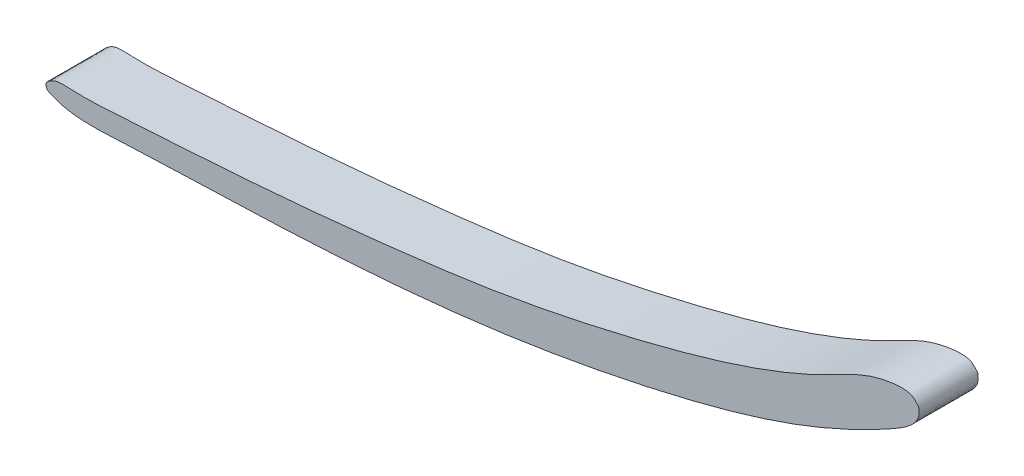
ISO-10303-21;
HEADER;
FILE_DESCRIPTION(('STEP AP214'),'2;1');
FILE_NAME('part.step','',(''),(''),'','','');
FILE_SCHEMA(('AUTOMOTIVE_DESIGN { 1 0 10303 214 1 1 1 1 }'));
ENDSEC;
DATA;
#1=APPLICATION_CONTEXT('core data for automotive mechanical design processes');
#2=APPLICATION_PROTOCOL_DEFINITION('international standard','automotive_design',2000,#1);
#3=PRODUCT_CONTEXT('',#1,'mechanical');
#4=PRODUCT('Part','Part','',(#3));
#5=PRODUCT_RELATED_PRODUCT_CATEGORY('part','',(#4));
#6=PRODUCT_DEFINITION_FORMATION('','',#4);
#7=PRODUCT_DEFINITION_CONTEXT('part definition',#1,'design');
#8=PRODUCT_DEFINITION('design','',#6,#7);
#9=PRODUCT_DEFINITION_SHAPE('','',#8);
#10=(LENGTH_UNIT() NAMED_UNIT(*) SI_UNIT(.MILLI.,.METRE.));
#11=(NAMED_UNIT(*) PLANE_ANGLE_UNIT() SI_UNIT($,.RADIAN.));
#12=(NAMED_UNIT(*) SI_UNIT($,.STERADIAN.) SOLID_ANGLE_UNIT());
#13=UNCERTAINTY_MEASURE_WITH_UNIT(LENGTH_MEASURE(1.E-05),#10,'distance_accuracy_value','');
#14=(GEOMETRIC_REPRESENTATION_CONTEXT(3) GLOBAL_UNCERTAINTY_ASSIGNED_CONTEXT((#13)) GLOBAL_UNIT_ASSIGNED_CONTEXT((#10,
#11,#12)) REPRESENTATION_CONTEXT('',''));
#15=CARTESIAN_POINT('',(0.,0.,0.));
#16=DIRECTION('',(0.,0.,1.));
#17=DIRECTION('',(1.,0.,0.));
#18=AXIS2_PLACEMENT_3D('',#15,#16,#17);
#19=CARTESIAN_POINT('',(63.9605641824805,0.,396.));
#20=CARTESIAN_POINT('',(63.9364417178556,0.0781121791034178,396.));
#21=CARTESIAN_POINT('',(63.8857154035115,0.141936559323125,396.));
#22=CARTESIAN_POINT('',(63.7791898423631,0.262983376319914,396.));
#23=CARTESIAN_POINT('',(63.7223889440184,0.320167276240679,396.));
#24=CARTESIAN_POINT('',(63.5554509824714,0.494989219660763,396.));
#25=CARTESIAN_POINT('',(63.4449655076295,0.613675125034685,396.));
#26=CARTESIAN_POINT('',(63.2621928824469,0.769373163164444,396.));
#27=CARTESIAN_POINT('',(63.1989324021187,0.817932085720896,396.));
#28=CARTESIAN_POINT('',(63.0638801444793,0.902851802525056,396.));
#29=CARTESIAN_POINT('',(62.9919915644782,0.939578358661985,396.));
#30=CARTESIAN_POINT('',(62.7673480034913,1.03371957762963,396.));
#31=CARTESIAN_POINT('',(62.6121126705674,1.07296788645708,396.));
#32=CARTESIAN_POINT('',(62.2963399681258,1.12868630365626,396.));
#33=CARTESIAN_POINT('',(62.1350838069397,1.1445633431546,396.));
#34=CARTESIAN_POINT('',(61.8149286968657,1.16381460467546,396.));
#35=CARTESIAN_POINT('',(61.6552935429728,1.16702172837577,396.));
#36=CARTESIAN_POINT('',(61.1775713763588,1.15947545009476,396.));
#37=CARTESIAN_POINT('',(60.8605818765506,1.13279895552021,396.));
#38=CARTESIAN_POINT('',(59.9117221460889,1.02217473067182,396.));
#39=CARTESIAN_POINT('',(59.2800657341597,0.902268558667568,396.));
#40=CARTESIAN_POINT('',(58.049044202402,0.596374024892515,396.));
#41=CARTESIAN_POINT('',(57.4468241031709,0.407853051652973,396.));
#42=CARTESIAN_POINT('',(55.677800613294,-0.258448287346613,396.));
#43=CARTESIAN_POINT('',(54.5458147503454,-0.829893929675807,396.));
#44=CARTESIAN_POINT('',(52.8553948630676,-1.70573860962117,396.));
#45=CARTESIAN_POINT('',(52.2927886399589,-1.99970275517772,396.));
#46=CARTESIAN_POINT('',(51.1619440430842,-2.57453645842998,396.));
#47=CARTESIAN_POINT('',(50.5942697187742,-2.85671741484489,396.));
#48=CARTESIAN_POINT('',(48.8788981631485,-3.67455018542304,396.));
#49=CARTESIAN_POINT('',(47.7188753123864,-4.18154528981252,396.));
#50=CARTESIAN_POINT('',(45.3762267641915,-5.1429845318901,396.));
#51=CARTESIAN_POINT('',(44.1938155475604,-5.59792733125708,396.));
#52=CARTESIAN_POINT('',(41.813306974254,-6.471343106736,396.));
#53=CARTESIAN_POINT('',(40.6140730196811,-6.88901575731155,396.));
#54=CARTESIAN_POINT('',(38.202880863236,-7.6827833974463,396.));
#55=CARTESIAN_POINT('',(36.991048696348,-8.05963742540589,396.));
#56=CARTESIAN_POINT('',(33.3412509259783,-9.14426503425753,396.));
#57=CARTESIAN_POINT('',(30.8904924722374,-9.8083890681549,396.));
#58=CARTESIAN_POINT('',(25.9730763418653,-11.0646026392726,396.));
#59=CARTESIAN_POINT('',(23.5046574026082,-11.6539917001972,396.));
#60=CARTESIAN_POINT('',(18.5518424970012,-12.7690686422222,396.));
#61=CARTESIAN_POINT('',(16.0688753832785,-13.2961352101383,396.));
#62=CARTESIAN_POINT('',(11.0874948241167,-14.2667992937747,396.));
#63=CARTESIAN_POINT('',(8.58809949624322,-14.7079820908635,396.));
#64=CARTESIAN_POINT('',(3.57276939772493,-15.5001894745998,396.));
#65=CARTESIAN_POINT('',(1.05918363406748,-15.8518553141857,396.));
#66=CARTESIAN_POINT('',(-3.97538595576315,-16.4996609221552,396.));
#67=CARTESIAN_POINT('',(-6.49625399443243,-16.7978188656575,396.));
#68=CARTESIAN_POINT('',(-14.0640727314466,-17.6449340687965,396.));
#69=CARTESIAN_POINT('',(-19.1169239021322,-18.1382658568147,396.));
#70=CARTESIAN_POINT('',(-29.2379405362892,-18.952070936949,396.));
#71=CARTESIAN_POINT('',(-34.304400435551,-19.2819696316091,396.));
#72=CARTESIAN_POINT('',(-40.6374996242203,-19.6887719971686,396.));
#73=CARTESIAN_POINT('',(-41.9041764505805,-19.7692774024994,396.));
#74=CARTESIAN_POINT('',(-43.8045592248311,-19.8840338546491,396.));
#75=CARTESIAN_POINT('',(-44.438097937279,-19.9209529314474,396.));
#76=CARTESIAN_POINT('',(-45.7051757534743,-19.9947843792109,396.));
#77=CARTESIAN_POINT('',(-46.3388124461785,-20.0322724169331,396.));
#78=CARTESIAN_POINT('',(-47.6062580388319,-20.0917064911756,396.));
#79=CARTESIAN_POINT('',(-48.2399898388446,-20.1123758225531,396.));
#80=CARTESIAN_POINT('',(-49.1906180472217,-20.1127223035103,396.));
#81=CARTESIAN_POINT('',(-49.5074985051993,-20.1084278227332,396.));
#82=CARTESIAN_POINT('',(-50.1412708383086,-20.0883658877208,396.));
#83=CARTESIAN_POINT('',(-50.4581644305675,-20.0708729108979,396.));
#84=CARTESIAN_POINT('',(-51.0919483047523,-20.039213474975,396.));
#85=CARTESIAN_POINT('',(-51.4090305104685,-20.0272061181891,396.));
#86=CARTESIAN_POINT('',(-51.8833192732668,-20.0347122417491,396.));
#87=CARTESIAN_POINT('',(-52.0412251105031,-20.0410921914749,396.));
#88=CARTESIAN_POINT('',(-52.3562793294255,-20.0692779346559,396.));
#89=CARTESIAN_POINT('',(-52.5147219686342,-20.0912910497223,396.));
#90=CARTESIAN_POINT('',(-52.8234741528538,-20.1604842715979,396.));
#91=CARTESIAN_POINT('',(-52.9729373663881,-20.2076086092815,396.));
#92=CARTESIAN_POINT('',(-53.2586118565247,-20.3356494173459,396.));
#93=CARTESIAN_POINT('',(-53.395476809306,-20.4164761160239,396.));
#94=CARTESIAN_POINT('',(-53.5942181610452,-20.5488360623561,396.));
#95=CARTESIAN_POINT('',(-53.6590011614056,-20.5950575144297,396.));
#96=CARTESIAN_POINT('',(-53.7866468230102,-20.690256711473,396.));
#97=CARTESIAN_POINT('',(-53.8513569341475,-20.7369224567513,396.));
#98=CARTESIAN_POINT('',(-53.9422432805334,-20.8139369004266,396.));
#99=CARTESIAN_POINT('',(-53.9710040329837,-20.841364882774,396.));
#100=CARTESIAN_POINT('',(-54.0208251022194,-20.9050342025866,396.));
#101=CARTESIAN_POINT('',(-54.0407323270708,-20.9407964212352,396.));
#102=CARTESIAN_POINT('',(-54.0845829835444,-21.0534821158939,396.));
#103=CARTESIAN_POINT('',(-54.0911305463997,-21.1367832058413,396.));
#104=CARTESIAN_POINT('',(-54.0764145103459,-21.29770414158,396.));
#105=CARTESIAN_POINT('',(-54.0627481642123,-21.3771091184307,396.));
#106=CARTESIAN_POINT('',(-54.0269169213589,-21.5344971194906,396.));
#107=CARTESIAN_POINT('',(-54.002334722053,-21.6127407497809,396.));
#108=CARTESIAN_POINT('',(-53.93554314897,-21.7149574492617,396.));
#109=CARTESIAN_POINT('',(-53.9087295493738,-21.7448700004751,396.));
#110=CARTESIAN_POINT('',(-53.8447872628207,-21.7952643519712,396.));
#111=CARTESIAN_POINT('',(-53.8096457590253,-21.815342094121,396.));
#112=CARTESIAN_POINT('',(-53.7008002561413,-21.8677218020153,396.));
#113=CARTESIAN_POINT('',(-53.6234135329775,-21.8931380554598,396.));
#114=CARTESIAN_POINT('',(-53.2441215006423,-22.0347755220134,396.));
#115=CARTESIAN_POINT('',(-52.9534547832471,-22.1819803276002,396.));
#116=CARTESIAN_POINT('',(-52.3506304620983,-22.4151637666387,396.));
#117=CARTESIAN_POINT('',(-52.0400275406136,-22.5041159918664,396.));
#118=CARTESIAN_POINT('',(-51.4088346517422,-22.6519862698636,396.));
#119=CARTESIAN_POINT('',(-51.0891651190677,-22.7120053440771,396.));
#120=CARTESIAN_POINT('',(-49.4950921338197,-22.9607792013295,396.));
#121=CARTESIAN_POINT('',(-48.211797206383,-22.9767210211052,396.));
#122=CARTESIAN_POINT('',(-46.2841950601758,-22.9400429082679,396.));
#123=CARTESIAN_POINT('',(-45.641038257869,-22.9158061843158,396.));
#124=CARTESIAN_POINT('',(-44.3549191873322,-22.861296113794,396.));
#125=CARTESIAN_POINT('',(-43.7120308859577,-22.8303343340976,396.));
#126=CARTESIAN_POINT('',(-41.7833887366872,-22.7369564148102,396.));
#127=CARTESIAN_POINT('',(-40.4975696130086,-22.6760797766975,396.));
#128=CARTESIAN_POINT('',(-36.639331791706,-22.5141861828634,396.));
#129=CARTESIAN_POINT('',(-34.0662464144457,-22.4306882607879,396.));
#130=CARTESIAN_POINT('',(-28.9201339234363,-22.2621565962063,396.));
#131=CARTESIAN_POINT('',(-26.3471498314781,-22.1760323944295,396.));
#132=CARTESIAN_POINT('',(-18.6305863396289,-21.8594973877445,396.));
#133=CARTESIAN_POINT('',(-13.4888430072851,-21.5760846879212,396.));
#134=CARTESIAN_POINT('',(-3.22429538283139,-20.7546755170737,396.));
#135=CARTESIAN_POINT('',(1.8962998933988,-20.2256423569372,396.));
#136=CARTESIAN_POINT('',(12.0917542756051,-18.8457640244288,396.));
#137=CARTESIAN_POINT('',(17.1710329717945,-17.9925477559196,396.));
#138=CARTESIAN_POINT('',(24.7477399499543,-16.4880437202373,396.));
#139=CARTESIAN_POINT('',(27.2653290814367,-15.9498140389826,396.));
#140=CARTESIAN_POINT('',(32.2771745769461,-14.7925108485442,396.));
#141=CARTESIAN_POINT('',(34.772592415657,-14.1748161857138,396.));
#142=CARTESIAN_POINT('',(39.7314057881061,-12.8204111681597,396.));
#143=CARTESIAN_POINT('',(42.1949132879433,-12.0841169522104,396.));
#144=CARTESIAN_POINT('',(45.8538298639127,-10.8445952054061,396.));
#145=CARTESIAN_POINT('',(47.0682529816703,-10.4078826956711,396.));
#146=CARTESIAN_POINT('',(49.4770431823101,-9.48531883951323,396.));
#147=CARTESIAN_POINT('',(50.6713779727555,-8.99932981270385,396.));
#148=CARTESIAN_POINT('',(54.2222517243019,-7.46245319516259,396.));
#149=CARTESIAN_POINT('',(56.5451739244581,-6.33395470964063,396.));
#150=CARTESIAN_POINT('',(59.395797380492,-4.82520663549249,396.));
#151=CARTESIAN_POINT('',(59.9635215312363,-4.51855383965252,396.));
#152=CARTESIAN_POINT('',(60.8046004835642,-4.04046568022884,396.));
#153=CARTESIAN_POINT('',(61.0828937904391,-3.87750413355972,396.));
#154=CARTESIAN_POINT('',(61.6320576112298,-3.53865320827973,396.));
#155=CARTESIAN_POINT('',(61.9028801886558,-3.3637879045931,396.));
#156=CARTESIAN_POINT('',(62.426766624068,-2.99114370206077,396.));
#157=CARTESIAN_POINT('',(62.6798291328343,-2.79313315987384,396.));
#158=CARTESIAN_POINT('',(63.1548573577774,-2.35618369630386,396.));
#159=CARTESIAN_POINT('',(63.3752836858627,-2.11584154882399,396.));
#160=CARTESIAN_POINT('',(63.6547550934994,-1.7208937689491,396.));
#161=CARTESIAN_POINT('',(63.7410407578893,-1.58189754062302,396.));
#162=CARTESIAN_POINT('',(63.8818492286985,-1.29079730522999,396.));
#163=CARTESIAN_POINT('',(63.9370168520184,-1.13993220338898,396.));
#164=CARTESIAN_POINT('',(63.9900340076823,-0.818207742254412,396.));
#165=CARTESIAN_POINT('',(63.9830030873952,-0.652420898421852,396.));
#166=CARTESIAN_POINT('',(63.9751062369564,-0.406869316974257,396.));
#167=CARTESIAN_POINT('',(63.9759664370169,-0.325052476840365,396.));
#168=CARTESIAN_POINT('',(63.9797817459734,-0.16143900317489,396.));
#169=CARTESIAN_POINT('',(63.9846866471054,-0.0781121791034178,396.));
#170=CARTESIAN_POINT('',(63.9605641824805,0.,396.));
#171=B_SPLINE_CURVE_WITH_KNOTS('',3,(#19,#20,#21,#22,#23,#24,#25,#26,#27,#28,#29,#30,#31,#32,
#33,#34,#35,#36,#37,#38,#39,#40,#41,#42,#43,#44,#45,#46,#47,#48,#49,#50,#51,#52,#53,#54,#55,#56,
#57,#58,#59,#60,#61,#62,#63,#64,#65,#66,#67,#68,#69,#70,#71,#72,#73,#74,#75,#76,#77,#78,#79,#80,
#81,#82,#83,#84,#85,#86,#87,#88,#89,#90,#91,#92,#93,#94,#95,#96,#97,#98,#99,#100,#101,#102,#103,
#104,#105,#106,#107,#108,#109,#110,#111,#112,#113,#114,#115,#116,#117,#118,#119,#120,#121,#122,
#123,#124,#125,#126,#127,#128,#129,#130,#131,#132,#133,#134,#135,#136,#137,#138,#139,#140,#141,
#142,#143,#144,#145,#146,#147,#148,#149,#150,#151,#152,#153,#154,#155,#156,#157,#158,#159,#160,
#161,#162,#163,#164,#165,#166,#167,#168,#169,#170),.UNSPECIFIED.,.T.,.F.,(4,2,2,2,2,2,2,2,2,2,2,
2,2,2,2,2,2,2,2,2,2,2,2,2,2,2,2,2,2,2,2,2,2,2,2,2,2,2,2,2,2,2,2,2,2,2,2,2,2,2,2,2,2,2,2,2,2,2,2,
2,2,2,2,2,2,2,2,2,2,2,2,2,2,2,2,4),(0.,0.000976562500000138,0.00195312500000028,
0.00390625000000055,0.00488281250000069,0.00585937500000082,0.00781250000000095,
0.00976562500000098,0.011718750000001,0.0156250000000011,0.0234375000000012,0.0312500000000014,
0.0468750000000017,0.0546875000000018,0.062500000000002,0.0781250000000023,0.0937500000000026,
0.109375000000003,0.125000000000003,0.156250000000004,0.187500000000004,0.218750000000005,
0.250000000000005,0.281250000000006,0.312500000000007,0.375000000000008,0.437500000000009,
0.453125000000009,0.46093750000001,0.46875000000001,0.47656250000001,0.48046875000001,
0.48437500000001,0.48828125000001,0.49023437500001,0.49218750000001,0.49414062500001,
0.49609375000001,0.49707031250001,0.49804687500001,0.49853515625001,0.49902343750001,
0.50000000000001,0.50097656250001,0.50195312500001,0.50244140625001,0.50292968750001,
0.50390625000001,0.50781250000001,0.51171875000001,0.51562500000001,0.53125000000001,
0.539062500000009,0.546875000000009,0.562500000000009,0.593750000000008,0.625000000000008,
0.687500000000006,0.750000000000005,0.812500000000004,0.843750000000003,0.875000000000003,
0.906250000000002,0.921875000000002,0.937500000000002,0.968750000000001,0.976562500000001,
0.980468750000001,0.984375,0.98828125,0.9921875,0.994140625,0.99609375,0.998046875,0.9990234375,
1.),.UNSPECIFIED.);
#172=DIRECTION('',(0.,0.,-1.));
#173=VECTOR('',#172,1.);
#174=SURFACE_OF_LINEAR_EXTRUSION('',#171,#173);
#175=CARTESIAN_POINT('',(63.9605641824805,0.,396.));
#176=CARTESIAN_POINT('',(63.9846866471054,-0.0781121791034178,396.));
#177=CARTESIAN_POINT('',(63.9797817459734,-0.16143900317489,396.));
#178=CARTESIAN_POINT('',(63.9759664370169,-0.325052476840365,396.));
#179=CARTESIAN_POINT('',(63.9751062369564,-0.406869316974257,396.));
#180=CARTESIAN_POINT('',(63.9830030873952,-0.652420898421852,396.));
#181=CARTESIAN_POINT('',(63.9900340076823,-0.818207742254412,396.));
#182=CARTESIAN_POINT('',(63.9370168520184,-1.13993220338898,396.));
#183=CARTESIAN_POINT('',(63.8818492286985,-1.29079730522999,396.));
#184=CARTESIAN_POINT('',(63.7410407578893,-1.58189754062302,396.));
#185=CARTESIAN_POINT('',(63.6547550934994,-1.7208937689491,396.));
#186=CARTESIAN_POINT('',(63.3752836858627,-2.11584154882399,396.));
#187=CARTESIAN_POINT('',(63.1548573577774,-2.35618369630386,396.));
#188=CARTESIAN_POINT('',(62.6798291328343,-2.79313315987384,396.));
#189=CARTESIAN_POINT('',(62.426766624068,-2.99114370206077,396.));
#190=CARTESIAN_POINT('',(61.9028801886558,-3.3637879045931,396.));
#191=CARTESIAN_POINT('',(61.6320576112298,-3.53865320827973,396.));
#192=CARTESIAN_POINT('',(61.0828937904391,-3.87750413355972,396.));
#193=CARTESIAN_POINT('',(60.8046004835642,-4.04046568022884,396.));
#194=CARTESIAN_POINT('',(59.9635215312363,-4.51855383965252,396.));
#195=CARTESIAN_POINT('',(59.395797380492,-4.82520663549249,396.));
#196=CARTESIAN_POINT('',(56.5451739244581,-6.33395470964063,396.));
#197=CARTESIAN_POINT('',(54.2222517243019,-7.46245319516259,396.));
#198=CARTESIAN_POINT('',(50.6713779727555,-8.99932981270385,396.));
#199=CARTESIAN_POINT('',(49.4770431823101,-9.48531883951323,396.));
#200=CARTESIAN_POINT('',(47.0682529816703,-10.4078826956711,396.));
#201=CARTESIAN_POINT('',(45.8538298639127,-10.8445952054061,396.));
#202=CARTESIAN_POINT('',(42.1949132879433,-12.0841169522104,396.));
#203=CARTESIAN_POINT('',(39.7314057881061,-12.8204111681597,396.));
#204=CARTESIAN_POINT('',(34.772592415657,-14.1748161857138,396.));
#205=CARTESIAN_POINT('',(32.2771745769461,-14.7925108485442,396.));
#206=CARTESIAN_POINT('',(27.2653290814367,-15.9498140389826,396.));
#207=CARTESIAN_POINT('',(24.7477399499543,-16.4880437202373,396.));
#208=CARTESIAN_POINT('',(17.1710329717945,-17.9925477559196,396.));
#209=CARTESIAN_POINT('',(12.0917542756051,-18.8457640244288,396.));
#210=CARTESIAN_POINT('',(1.8962998933988,-20.2256423569372,396.));
#211=CARTESIAN_POINT('',(-3.22429538283139,-20.7546755170737,396.));
#212=CARTESIAN_POINT('',(-13.4888430072851,-21.5760846879212,396.));
#213=CARTESIAN_POINT('',(-18.6305863396289,-21.8594973877445,396.));
#214=CARTESIAN_POINT('',(-26.3471498314781,-22.1760323944295,396.));
#215=CARTESIAN_POINT('',(-28.9201339234363,-22.2621565962063,396.));
#216=CARTESIAN_POINT('',(-34.0662464144457,-22.4306882607879,396.));
#217=CARTESIAN_POINT('',(-36.639331791706,-22.5141861828634,396.));
#218=CARTESIAN_POINT('',(-40.4975696130086,-22.6760797766975,396.));
#219=CARTESIAN_POINT('',(-41.7833887366872,-22.7369564148102,396.));
#220=CARTESIAN_POINT('',(-43.7120308859577,-22.8303343340976,396.));
#221=CARTESIAN_POINT('',(-44.3549191873322,-22.861296113794,396.));
#222=CARTESIAN_POINT('',(-45.641038257869,-22.9158061843158,396.));
#223=CARTESIAN_POINT('',(-46.2841950601758,-22.9400429082679,396.));
#224=CARTESIAN_POINT('',(-48.211797206383,-22.9767210211052,396.));
#225=CARTESIAN_POINT('',(-49.4950921338197,-22.9607792013295,396.));
#226=CARTESIAN_POINT('',(-51.0891651190677,-22.7120053440771,396.));
#227=CARTESIAN_POINT('',(-51.4088346517422,-22.6519862698636,396.));
#228=CARTESIAN_POINT('',(-52.0400275406136,-22.5041159918664,396.));
#229=CARTESIAN_POINT('',(-52.3506304620983,-22.4151637666387,396.));
#230=CARTESIAN_POINT('',(-52.9534547832471,-22.1819803276002,396.));
#231=CARTESIAN_POINT('',(-53.2441215006423,-22.0347755220134,396.));
#232=CARTESIAN_POINT('',(-53.6234135329775,-21.8931380554598,396.));
#233=CARTESIAN_POINT('',(-53.7008002561413,-21.8677218020153,396.));
#234=CARTESIAN_POINT('',(-53.8096457590253,-21.815342094121,396.));
#235=CARTESIAN_POINT('',(-53.8447872628207,-21.7952643519712,396.));
#236=CARTESIAN_POINT('',(-53.9087295493738,-21.7448700004751,396.));
#237=CARTESIAN_POINT('',(-53.93554314897,-21.7149574492617,396.));
#238=CARTESIAN_POINT('',(-54.002334722053,-21.6127407497809,396.));
#239=CARTESIAN_POINT('',(-54.0269169213589,-21.5344971194906,396.));
#240=CARTESIAN_POINT('',(-54.0627481642123,-21.3771091184307,396.));
#241=CARTESIAN_POINT('',(-54.0764145103459,-21.29770414158,396.));
#242=CARTESIAN_POINT('',(-54.0911305463997,-21.1367832058413,396.));
#243=CARTESIAN_POINT('',(-54.0845829835444,-21.0534821158939,396.));
#244=CARTESIAN_POINT('',(-54.0407323270708,-20.9407964212352,396.));
#245=CARTESIAN_POINT('',(-54.0208251022194,-20.9050342025866,396.));
#246=CARTESIAN_POINT('',(-53.9710040329837,-20.841364882774,396.));
#247=CARTESIAN_POINT('',(-53.9422432805334,-20.8139369004266,396.));
#248=CARTESIAN_POINT('',(-53.8513569341475,-20.7369224567513,396.));
#249=CARTESIAN_POINT('',(-53.7866468230102,-20.690256711473,396.));
#250=CARTESIAN_POINT('',(-53.6590011614056,-20.5950575144297,396.));
#251=CARTESIAN_POINT('',(-53.5942181610452,-20.5488360623561,396.));
#252=CARTESIAN_POINT('',(-53.395476809306,-20.4164761160239,396.));
#253=CARTESIAN_POINT('',(-53.2586118565247,-20.3356494173459,396.));
#254=CARTESIAN_POINT('',(-52.9729373663881,-20.2076086092815,396.));
#255=CARTESIAN_POINT('',(-52.8234741528538,-20.1604842715979,396.));
#256=CARTESIAN_POINT('',(-52.5147219686342,-20.0912910497223,396.));
#257=CARTESIAN_POINT('',(-52.3562793294255,-20.0692779346559,396.));
#258=CARTESIAN_POINT('',(-52.0412251105031,-20.0410921914749,396.));
#259=CARTESIAN_POINT('',(-51.8833192732668,-20.0347122417491,396.));
#260=CARTESIAN_POINT('',(-51.4090305104685,-20.0272061181891,396.));
#261=CARTESIAN_POINT('',(-51.0919483047523,-20.039213474975,396.));
#262=CARTESIAN_POINT('',(-50.4581644305675,-20.0708729108979,396.));
#263=CARTESIAN_POINT('',(-50.1412708383086,-20.0883658877208,396.));
#264=CARTESIAN_POINT('',(-49.5074985051993,-20.1084278227332,396.));
#265=CARTESIAN_POINT('',(-49.1906180472217,-20.1127223035103,396.));
#266=CARTESIAN_POINT('',(-48.2399898388446,-20.1123758225531,396.));
#267=CARTESIAN_POINT('',(-47.6062580388319,-20.0917064911756,396.));
#268=CARTESIAN_POINT('',(-46.3388124461785,-20.0322724169331,396.));
#269=CARTESIAN_POINT('',(-45.7051757534743,-19.9947843792109,396.));
#270=CARTESIAN_POINT('',(-44.438097937279,-19.9209529314474,396.));
#271=CARTESIAN_POINT('',(-43.8045592248311,-19.8840338546491,396.));
#272=CARTESIAN_POINT('',(-41.9041764505805,-19.7692774024994,396.));
#273=CARTESIAN_POINT('',(-40.6374996242203,-19.6887719971686,396.));
#274=CARTESIAN_POINT('',(-34.304400435551,-19.2819696316091,396.));
#275=CARTESIAN_POINT('',(-29.2379405362892,-18.952070936949,396.));
#276=CARTESIAN_POINT('',(-19.1169239021322,-18.1382658568147,396.));
#277=CARTESIAN_POINT('',(-14.0640727314466,-17.6449340687965,396.));
#278=CARTESIAN_POINT('',(-6.49625399443243,-16.7978188656575,396.));
#279=CARTESIAN_POINT('',(-3.97538595576315,-16.4996609221552,396.));
#280=CARTESIAN_POINT('',(1.05918363406748,-15.8518553141857,396.));
#281=CARTESIAN_POINT('',(3.57276939772493,-15.5001894745998,396.));
#282=CARTESIAN_POINT('',(8.58809949624322,-14.7079820908635,396.));
#283=CARTESIAN_POINT('',(11.0874948241167,-14.2667992937747,396.));
#284=CARTESIAN_POINT('',(16.0688753832785,-13.2961352101383,396.));
#285=CARTESIAN_POINT('',(18.5518424970012,-12.7690686422222,396.));
#286=CARTESIAN_POINT('',(23.5046574026082,-11.6539917001972,396.));
#287=CARTESIAN_POINT('',(25.9730763418653,-11.0646026392726,396.));
#288=CARTESIAN_POINT('',(30.8904924722374,-9.8083890681549,396.));
#289=CARTESIAN_POINT('',(33.3412509259783,-9.14426503425753,396.));
#290=CARTESIAN_POINT('',(36.991048696348,-8.05963742540589,396.));
#291=CARTESIAN_POINT('',(38.202880863236,-7.6827833974463,396.));
#292=CARTESIAN_POINT('',(40.6140730196811,-6.88901575731155,396.));
#293=CARTESIAN_POINT('',(41.813306974254,-6.471343106736,396.));
#294=CARTESIAN_POINT('',(44.1938155475604,-5.59792733125708,396.));
#295=CARTESIAN_POINT('',(45.3762267641915,-5.1429845318901,396.));
#296=CARTESIAN_POINT('',(47.7188753123864,-4.18154528981252,396.));
#297=CARTESIAN_POINT('',(48.8788981631485,-3.67455018542304,396.));
#298=CARTESIAN_POINT('',(50.5942697187742,-2.85671741484489,396.));
#299=CARTESIAN_POINT('',(51.1619440430842,-2.57453645842998,396.));
#300=CARTESIAN_POINT('',(52.2927886399589,-1.99970275517772,396.));
#301=CARTESIAN_POINT('',(52.8553948630676,-1.70573860962117,396.));
#302=CARTESIAN_POINT('',(54.5458147503454,-0.829893929675807,396.));
#303=CARTESIAN_POINT('',(55.677800613294,-0.258448287346613,396.));
#304=CARTESIAN_POINT('',(57.4468241031709,0.407853051652973,396.));
#305=CARTESIAN_POINT('',(58.049044202402,0.596374024892515,396.));
#306=CARTESIAN_POINT('',(59.2800657341597,0.902268558667568,396.));
#307=CARTESIAN_POINT('',(59.9117221460889,1.02217473067182,396.));
#308=CARTESIAN_POINT('',(60.8605818765506,1.13279895552021,396.));
#309=CARTESIAN_POINT('',(61.1775713763588,1.15947545009476,396.));
#310=CARTESIAN_POINT('',(61.6552935429728,1.16702172837577,396.));
#311=CARTESIAN_POINT('',(61.8149286968657,1.16381460467546,396.));
#312=CARTESIAN_POINT('',(62.1350838069397,1.1445633431546,396.));
#313=CARTESIAN_POINT('',(62.2963399681258,1.12868630365626,396.));
#314=CARTESIAN_POINT('',(62.6121126705674,1.07296788645708,396.));
#315=CARTESIAN_POINT('',(62.7673480034913,1.03371957762963,396.));
#316=CARTESIAN_POINT('',(62.9919915644782,0.939578358661985,396.));
#317=CARTESIAN_POINT('',(63.0638801444793,0.902851802525056,396.));
#318=CARTESIAN_POINT('',(63.1989324021187,0.817932085720896,396.));
#319=CARTESIAN_POINT('',(63.2621928824469,0.769373163164444,396.));
#320=CARTESIAN_POINT('',(63.4449655076295,0.613675125034685,396.));
#321=CARTESIAN_POINT('',(63.5554509824714,0.494989219660763,396.));
#322=CARTESIAN_POINT('',(63.7223889440184,0.320167276240679,396.));
#323=CARTESIAN_POINT('',(63.7791898423631,0.262983376319914,396.));
#324=CARTESIAN_POINT('',(63.8857154035115,0.141936559323125,396.));
#325=CARTESIAN_POINT('',(63.9364417178556,0.0781121791034178,396.));
#326=CARTESIAN_POINT('',(63.9605641824805,0.,396.));
#327=B_SPLINE_CURVE_WITH_KNOTS('',3,(#175,#176,#177,#178,#179,#180,#181,#182,#183,#184,#185,
#186,#187,#188,#189,#190,#191,#192,#193,#194,#195,#196,#197,#198,#199,#200,#201,#202,#203,#204,
#205,#206,#207,#208,#209,#210,#211,#212,#213,#214,#215,#216,#217,#218,#219,#220,#221,#222,#223,
#224,#225,#226,#227,#228,#229,#230,#231,#232,#233,#234,#235,#236,#237,#238,#239,#240,#241,#242,
#243,#244,#245,#246,#247,#248,#249,#250,#251,#252,#253,#254,#255,#256,#257,#258,#259,#260,#261,
#262,#263,#264,#265,#266,#267,#268,#269,#270,#271,#272,#273,#274,#275,#276,#277,#278,#279,#280,
#281,#282,#283,#284,#285,#286,#287,#288,#289,#290,#291,#292,#293,#294,#295,#296,#297,#298,#299,
#300,#301,#302,#303,#304,#305,#306,#307,#308,#309,#310,#311,#312,#313,#314,#315,#316,#317,#318,
#319,#320,#321,#322,#323,#324,#325,#326),.UNSPECIFIED.,.T.,.F.,(4,2,2,2,2,2,2,2,2,2,2,2,2,2,2,2,
2,2,2,2,2,2,2,2,2,2,2,2,2,2,2,2,2,2,2,2,2,2,2,2,2,2,2,2,2,2,2,2,2,2,2,2,2,2,2,2,2,2,2,2,2,2,2,2,
2,2,2,2,2,2,2,2,2,2,2,4),(0.,0.000976562499999889,0.00195312499999989,0.00390624999999989,
0.00585937499999978,0.00781249999999978,0.0117187499999997,0.0156249999999996,
0.0195312499999994,0.0234374999999993,0.0312499999999991,0.0624999999999984,0.078124999999998,
0.0937499999999977,0.124999999999997,0.156249999999997,0.187499999999996,0.249999999999995,
0.312499999999994,0.374999999999992,0.406249999999992,0.437499999999991,0.453124999999991,
0.460937499999991,0.46874999999999,0.48437499999999,0.48828124999999,0.49218749999999,
0.49609374999999,0.49707031249999,0.49755859374999,0.49804687499999,0.49902343749999,
0.49999999999999,0.50097656249999,0.50146484374999,0.50195312499999,0.50292968749999,
0.50390624999999,0.50585937499999,0.50781249999999,0.50976562499999,0.51171874999999,
0.51562499999999,0.51953124999999,0.52343749999999,0.53124999999999,0.53906249999999,
0.54687499999999,0.562499999999991,0.624999999999992,0.687499999999993,0.718749999999994,
0.749999999999994,0.781249999999995,0.812499999999996,0.843749999999996,0.874999999999997,
0.890624999999997,0.906249999999997,0.921874999999998,0.937499999999998,0.945312499999998,
0.953124999999998,0.968749999999999,0.976562499999999,0.984374999999999,0.988281249999999,
0.990234374999999,0.992187499999999,0.994140624999999,0.995117187499999,0.996093749999999,
0.998046875,0.9990234375,1.),.UNSPECIFIED.);
#328=CARTESIAN_POINT('',(63.9605641824805,0.,396.));
#329=VERTEX_POINT('',#328);
#330=EDGE_CURVE('E10',#329,#329,#327,.F.);
#331=ORIENTED_EDGE('',*,*,#330,.F.);
#332=EDGE_LOOP('',(#331));
#333=FACE_BOUND('',#332,.T.);
#334=CARTESIAN_POINT('',(63.9605641824805,0.,388.000000000001));
#335=CARTESIAN_POINT('',(63.9364417178556,0.0781121791034178,388.000000000001));
#336=CARTESIAN_POINT('',(63.8857154035115,0.141936559323125,388.000000000001));
#337=CARTESIAN_POINT('',(63.7791898423631,0.262983376319914,388.000000000001));
#338=CARTESIAN_POINT('',(63.7223889440184,0.320167276240679,388.000000000001));
#339=CARTESIAN_POINT('',(63.5554509824714,0.494989219660763,388.000000000001));
#340=CARTESIAN_POINT('',(63.4449655076295,0.613675125034685,388.000000000001));
#341=CARTESIAN_POINT('',(63.2621928824469,0.769373163164444,388.000000000001));
#342=CARTESIAN_POINT('',(63.1989324021187,0.817932085720896,388.000000000001));
#343=CARTESIAN_POINT('',(63.0638801444793,0.902851802525056,388.000000000001));
#344=CARTESIAN_POINT('',(62.9919915644782,0.939578358661985,388.000000000001));
#345=CARTESIAN_POINT('',(62.7673480034913,1.03371957762963,388.000000000001));
#346=CARTESIAN_POINT('',(62.6121126705674,1.07296788645708,388.000000000001));
#347=CARTESIAN_POINT('',(62.2963399681258,1.12868630365626,388.000000000001));
#348=CARTESIAN_POINT('',(62.1350838069397,1.1445633431546,388.000000000001));
#349=CARTESIAN_POINT('',(61.8149286968657,1.16381460467546,388.000000000001));
#350=CARTESIAN_POINT('',(61.6552935429728,1.16702172837577,388.000000000001));
#351=CARTESIAN_POINT('',(61.1775713763588,1.15947545009476,388.000000000001));
#352=CARTESIAN_POINT('',(60.8605818765506,1.13279895552021,388.000000000001));
#353=CARTESIAN_POINT('',(59.9117221460889,1.02217473067182,388.000000000001));
#354=CARTESIAN_POINT('',(59.2800657341597,0.902268558667568,388.000000000001));
#355=CARTESIAN_POINT('',(58.049044202402,0.596374024892515,388.000000000001));
#356=CARTESIAN_POINT('',(57.4468241031709,0.407853051652973,388.000000000001));
#357=CARTESIAN_POINT('',(55.677800613294,-0.258448287346613,388.000000000001));
#358=CARTESIAN_POINT('',(54.5458147503454,-0.829893929675807,388.000000000001));
#359=CARTESIAN_POINT('',(52.8553948630676,-1.70573860962117,388.000000000001));
#360=CARTESIAN_POINT('',(52.2927886399589,-1.99970275517772,388.000000000001));
#361=CARTESIAN_POINT('',(51.1619440430842,-2.57453645842998,388.000000000001));
#362=CARTESIAN_POINT('',(50.5942697187742,-2.85671741484489,388.000000000001));
#363=CARTESIAN_POINT('',(48.8788981631485,-3.67455018542304,388.000000000001));
#364=CARTESIAN_POINT('',(47.7188753123864,-4.18154528981252,388.000000000001));
#365=CARTESIAN_POINT('',(45.3762267641915,-5.1429845318901,388.000000000001));
#366=CARTESIAN_POINT('',(44.1938155475604,-5.59792733125708,388.000000000001));
#367=CARTESIAN_POINT('',(41.813306974254,-6.471343106736,388.000000000001));
#368=CARTESIAN_POINT('',(40.6140730196811,-6.88901575731155,388.000000000001));
#369=CARTESIAN_POINT('',(38.202880863236,-7.6827833974463,388.000000000001));
#370=CARTESIAN_POINT('',(36.991048696348,-8.05963742540589,388.000000000001));
#371=CARTESIAN_POINT('',(33.3412509259783,-9.14426503425753,388.000000000001));
#372=CARTESIAN_POINT('',(30.8904924722374,-9.8083890681549,388.000000000001));
#373=CARTESIAN_POINT('',(25.9730763418653,-11.0646026392726,388.000000000001));
#374=CARTESIAN_POINT('',(23.5046574026082,-11.6539917001972,388.000000000001));
#375=CARTESIAN_POINT('',(18.5518424970012,-12.7690686422222,388.000000000001));
#376=CARTESIAN_POINT('',(16.0688753832785,-13.2961352101383,388.000000000001));
#377=CARTESIAN_POINT('',(11.0874948241167,-14.2667992937747,388.000000000001));
#378=CARTESIAN_POINT('',(8.58809949624322,-14.7079820908635,388.000000000001));
#379=CARTESIAN_POINT('',(3.57276939772493,-15.5001894745998,388.000000000001));
#380=CARTESIAN_POINT('',(1.05918363406748,-15.8518553141857,388.000000000001));
#381=CARTESIAN_POINT('',(-3.97538595576315,-16.4996609221552,388.000000000001));
#382=CARTESIAN_POINT('',(-6.49625399443243,-16.7978188656575,388.000000000001));
#383=CARTESIAN_POINT('',(-14.0640727314466,-17.6449340687965,388.000000000001));
#384=CARTESIAN_POINT('',(-19.1169239021322,-18.1382658568147,388.000000000001));
#385=CARTESIAN_POINT('',(-29.2379405362892,-18.952070936949,388.000000000001));
#386=CARTESIAN_POINT('',(-34.304400435551,-19.2819696316091,388.000000000001));
#387=CARTESIAN_POINT('',(-40.6374996242203,-19.6887719971686,388.000000000001));
#388=CARTESIAN_POINT('',(-41.9041764505805,-19.7692774024994,388.000000000001));
#389=CARTESIAN_POINT('',(-43.8045592248311,-19.8840338546491,388.000000000001));
#390=CARTESIAN_POINT('',(-44.438097937279,-19.9209529314474,388.000000000001));
#391=CARTESIAN_POINT('',(-45.7051757534743,-19.9947843792109,388.000000000001));
#392=CARTESIAN_POINT('',(-46.3388124461785,-20.0322724169331,388.000000000001));
#393=CARTESIAN_POINT('',(-47.6062580388319,-20.0917064911756,388.000000000001));
#394=CARTESIAN_POINT('',(-48.2399898388446,-20.1123758225531,388.000000000001));
#395=CARTESIAN_POINT('',(-49.1906180472217,-20.1127223035103,388.000000000001));
#396=CARTESIAN_POINT('',(-49.5074985051993,-20.1084278227332,388.000000000001));
#397=CARTESIAN_POINT('',(-50.1412708383086,-20.0883658877208,388.000000000001));
#398=CARTESIAN_POINT('',(-50.4581644305675,-20.0708729108979,388.000000000001));
#399=CARTESIAN_POINT('',(-51.0919483047523,-20.039213474975,388.000000000001));
#400=CARTESIAN_POINT('',(-51.4090305104685,-20.0272061181891,388.000000000001));
#401=CARTESIAN_POINT('',(-51.8833192732668,-20.0347122417491,388.000000000001));
#402=CARTESIAN_POINT('',(-52.0412251105031,-20.0410921914749,388.000000000001));
#403=CARTESIAN_POINT('',(-52.3562793294255,-20.0692779346559,388.000000000001));
#404=CARTESIAN_POINT('',(-52.5147219686342,-20.0912910497223,388.000000000001));
#405=CARTESIAN_POINT('',(-52.8234741528538,-20.1604842715979,388.000000000001));
#406=CARTESIAN_POINT('',(-52.9729373663881,-20.2076086092815,388.000000000001));
#407=CARTESIAN_POINT('',(-53.2586118565247,-20.3356494173459,388.000000000001));
#408=CARTESIAN_POINT('',(-53.395476809306,-20.4164761160239,388.000000000001));
#409=CARTESIAN_POINT('',(-53.5942181610452,-20.5488360623561,388.000000000001));
#410=CARTESIAN_POINT('',(-53.6590011614056,-20.5950575144297,388.000000000001));
#411=CARTESIAN_POINT('',(-53.7866468230102,-20.690256711473,388.000000000001));
#412=CARTESIAN_POINT('',(-53.8513569341475,-20.7369224567513,388.000000000001));
#413=CARTESIAN_POINT('',(-53.9422432805334,-20.8139369004266,388.000000000001));
#414=CARTESIAN_POINT('',(-53.9710040329837,-20.841364882774,388.000000000001));
#415=CARTESIAN_POINT('',(-54.0208251022194,-20.9050342025866,388.000000000001));
#416=CARTESIAN_POINT('',(-54.0407323270708,-20.9407964212352,388.000000000001));
#417=CARTESIAN_POINT('',(-54.0845829835444,-21.0534821158939,388.000000000001));
#418=CARTESIAN_POINT('',(-54.0911305463997,-21.1367832058413,388.000000000001));
#419=CARTESIAN_POINT('',(-54.0764145103459,-21.29770414158,388.000000000001));
#420=CARTESIAN_POINT('',(-54.0627481642123,-21.3771091184307,388.000000000001));
#421=CARTESIAN_POINT('',(-54.0269169213589,-21.5344971194906,388.000000000001));
#422=CARTESIAN_POINT('',(-54.002334722053,-21.6127407497809,388.000000000001));
#423=CARTESIAN_POINT('',(-53.93554314897,-21.7149574492617,388.000000000001));
#424=CARTESIAN_POINT('',(-53.9087295493738,-21.7448700004751,388.000000000001));
#425=CARTESIAN_POINT('',(-53.8447872628207,-21.7952643519712,388.000000000001));
#426=CARTESIAN_POINT('',(-53.8096457590253,-21.815342094121,388.000000000001));
#427=CARTESIAN_POINT('',(-53.7008002561413,-21.8677218020153,388.000000000001));
#428=CARTESIAN_POINT('',(-53.6234135329775,-21.8931380554598,388.000000000001));
#429=CARTESIAN_POINT('',(-53.2441215006423,-22.0347755220134,388.000000000001));
#430=CARTESIAN_POINT('',(-52.9534547832471,-22.1819803276002,388.000000000001));
#431=CARTESIAN_POINT('',(-52.3506304620983,-22.4151637666387,388.000000000001));
#432=CARTESIAN_POINT('',(-52.0400275406136,-22.5041159918664,388.000000000001));
#433=CARTESIAN_POINT('',(-51.4088346517422,-22.6519862698636,388.000000000001));
#434=CARTESIAN_POINT('',(-51.0891651190677,-22.7120053440771,388.000000000001));
#435=CARTESIAN_POINT('',(-49.4950921338197,-22.9607792013295,388.000000000001));
#436=CARTESIAN_POINT('',(-48.211797206383,-22.9767210211052,388.000000000001));
#437=CARTESIAN_POINT('',(-46.2841950601758,-22.9400429082679,388.000000000001));
#438=CARTESIAN_POINT('',(-45.641038257869,-22.9158061843158,388.000000000001));
#439=CARTESIAN_POINT('',(-44.3549191873322,-22.861296113794,388.000000000001));
#440=CARTESIAN_POINT('',(-43.7120308859577,-22.8303343340976,388.000000000001));
#441=CARTESIAN_POINT('',(-41.7833887366872,-22.7369564148102,388.000000000001));
#442=CARTESIAN_POINT('',(-40.4975696130086,-22.6760797766975,388.000000000001));
#443=CARTESIAN_POINT('',(-36.639331791706,-22.5141861828634,388.000000000001));
#444=CARTESIAN_POINT('',(-34.0662464144457,-22.4306882607879,388.000000000001));
#445=CARTESIAN_POINT('',(-28.9201339234363,-22.2621565962063,388.000000000001));
#446=CARTESIAN_POINT('',(-26.3471498314781,-22.1760323944295,388.000000000001));
#447=CARTESIAN_POINT('',(-18.6305863396289,-21.8594973877445,388.000000000001));
#448=CARTESIAN_POINT('',(-13.4888430072851,-21.5760846879212,388.000000000001));
#449=CARTESIAN_POINT('',(-3.22429538283139,-20.7546755170737,388.000000000001));
#450=CARTESIAN_POINT('',(1.8962998933988,-20.2256423569372,388.000000000001));
#451=CARTESIAN_POINT('',(12.0917542756051,-18.8457640244288,388.000000000001));
#452=CARTESIAN_POINT('',(17.1710329717945,-17.9925477559196,388.000000000001));
#453=CARTESIAN_POINT('',(24.7477399499543,-16.4880437202373,388.000000000001));
#454=CARTESIAN_POINT('',(27.2653290814367,-15.9498140389826,388.000000000001));
#455=CARTESIAN_POINT('',(32.2771745769461,-14.7925108485442,388.000000000001));
#456=CARTESIAN_POINT('',(34.772592415657,-14.1748161857138,388.000000000001));
#457=CARTESIAN_POINT('',(39.7314057881061,-12.8204111681597,388.000000000001));
#458=CARTESIAN_POINT('',(42.1949132879433,-12.0841169522104,388.000000000001));
#459=CARTESIAN_POINT('',(45.8538298639127,-10.8445952054061,388.000000000001));
#460=CARTESIAN_POINT('',(47.0682529816703,-10.4078826956711,388.000000000001));
#461=CARTESIAN_POINT('',(49.4770431823101,-9.48531883951323,388.000000000001));
#462=CARTESIAN_POINT('',(50.6713779727555,-8.99932981270385,388.000000000001));
#463=CARTESIAN_POINT('',(54.2222517243019,-7.46245319516259,388.000000000001));
#464=CARTESIAN_POINT('',(56.5451739244581,-6.33395470964063,388.000000000001));
#465=CARTESIAN_POINT('',(59.395797380492,-4.82520663549249,388.000000000001));
#466=CARTESIAN_POINT('',(59.9635215312363,-4.51855383965252,388.000000000001));
#467=CARTESIAN_POINT('',(60.8046004835642,-4.04046568022884,388.000000000001));
#468=CARTESIAN_POINT('',(61.0828937904391,-3.87750413355972,388.000000000001));
#469=CARTESIAN_POINT('',(61.6320576112298,-3.53865320827973,388.000000000001));
#470=CARTESIAN_POINT('',(61.9028801886558,-3.3637879045931,388.000000000001));
#471=CARTESIAN_POINT('',(62.426766624068,-2.99114370206077,388.000000000001));
#472=CARTESIAN_POINT('',(62.6798291328343,-2.79313315987384,388.000000000001));
#473=CARTESIAN_POINT('',(63.1548573577774,-2.35618369630386,388.000000000001));
#474=CARTESIAN_POINT('',(63.3752836858627,-2.11584154882399,388.000000000001));
#475=CARTESIAN_POINT('',(63.6547550934994,-1.7208937689491,388.000000000001));
#476=CARTESIAN_POINT('',(63.7410407578893,-1.58189754062302,388.000000000001));
#477=CARTESIAN_POINT('',(63.8818492286985,-1.29079730522999,388.000000000001));
#478=CARTESIAN_POINT('',(63.9370168520184,-1.13993220338898,388.000000000001));
#479=CARTESIAN_POINT('',(63.9900340076823,-0.818207742254412,388.000000000001));
#480=CARTESIAN_POINT('',(63.9830030873952,-0.652420898421852,388.000000000001));
#481=CARTESIAN_POINT('',(63.9751062369564,-0.406869316974257,388.000000000001));
#482=CARTESIAN_POINT('',(63.9759664370169,-0.325052476840365,388.000000000001));
#483=CARTESIAN_POINT('',(63.9797817459734,-0.16143900317489,388.000000000001));
#484=CARTESIAN_POINT('',(63.9846866471054,-0.0781121791034178,388.000000000001));
#485=CARTESIAN_POINT('',(63.9605641824805,0.,388.000000000001));
#486=B_SPLINE_CURVE_WITH_KNOTS('',3,(#334,#335,#336,#337,#338,#339,#340,#341,#342,#343,#344,
#345,#346,#347,#348,#349,#350,#351,#352,#353,#354,#355,#356,#357,#358,#359,#360,#361,#362,#363,
#364,#365,#366,#367,#368,#369,#370,#371,#372,#373,#374,#375,#376,#377,#378,#379,#380,#381,#382,
#383,#384,#385,#386,#387,#388,#389,#390,#391,#392,#393,#394,#395,#396,#397,#398,#399,#400,#401,
#402,#403,#404,#405,#406,#407,#408,#409,#410,#411,#412,#413,#414,#415,#416,#417,#418,#419,#420,
#421,#422,#423,#424,#425,#426,#427,#428,#429,#430,#431,#432,#433,#434,#435,#436,#437,#438,#439,
#440,#441,#442,#443,#444,#445,#446,#447,#448,#449,#450,#451,#452,#453,#454,#455,#456,#457,#458,
#459,#460,#461,#462,#463,#464,#465,#466,#467,#468,#469,#470,#471,#472,#473,#474,#475,#476,#477,
#478,#479,#480,#481,#482,#483,#484,#485),.UNSPECIFIED.,.T.,.F.,(4,2,2,2,2,2,2,2,2,2,2,2,2,2,2,2,
2,2,2,2,2,2,2,2,2,2,2,2,2,2,2,2,2,2,2,2,2,2,2,2,2,2,2,2,2,2,2,2,2,2,2,2,2,2,2,2,2,2,2,2,2,2,2,2,
2,2,2,2,2,2,2,2,2,2,2,4),(0.,0.000976562500000138,0.00195312500000028,0.00390625000000055,
0.00488281250000069,0.00585937500000082,0.00781250000000095,0.00976562500000098,
0.011718750000001,0.0156250000000011,0.0234375000000012,0.0312500000000014,0.0468750000000017,
0.0546875000000018,0.062500000000002,0.0781250000000023,0.0937500000000026,0.109375000000003,
0.125000000000003,0.156250000000004,0.187500000000004,0.218750000000005,0.250000000000005,
0.281250000000006,0.312500000000007,0.375000000000008,0.437500000000009,0.453125000000009,
0.46093750000001,0.46875000000001,0.47656250000001,0.48046875000001,0.48437500000001,
0.48828125000001,0.49023437500001,0.49218750000001,0.49414062500001,0.49609375000001,
0.49707031250001,0.49804687500001,0.49853515625001,0.49902343750001,0.50000000000001,
0.50097656250001,0.50195312500001,0.50244140625001,0.50292968750001,0.50390625000001,
0.50781250000001,0.51171875000001,0.51562500000001,0.53125000000001,0.539062500000009,
0.546875000000009,0.562500000000009,0.593750000000008,0.625000000000008,0.687500000000006,
0.750000000000005,0.812500000000004,0.843750000000003,0.875000000000003,0.906250000000002,
0.921875000000002,0.937500000000002,0.968750000000001,0.976562500000001,0.980468750000001,
0.984375,0.98828125,0.9921875,0.994140625,0.99609375,0.998046875,0.9990234375,1.),.UNSPECIFIED.);
#487=CARTESIAN_POINT('',(63.9605641824805,0.,388.000000000001));
#488=VERTEX_POINT('',#487);
#489=EDGE_CURVE('E38',#488,#488,#486,.T.);
#490=ORIENTED_EDGE('',*,*,#489,.T.);
#491=EDGE_LOOP('',(#490));
#492=FACE_BOUND('',#491,.T.);
#493=ADVANCED_FACE('F28',(#333,#492),#174,.F.);
#494=CARTESIAN_POINT('',(-54.083772528373,-21.2172436737082,396.));
#495=DIRECTION('',(0.,0.,-1.));
#496=DIRECTION('',(-1.,0.,0.));
#497=AXIS2_PLACEMENT_3D('',#494,#495,#496);
#498=PLANE('',#497);
#499=ORIENTED_EDGE('',*,*,#330,.T.);
#500=EDGE_LOOP('',(#499));
#501=FACE_BOUND('',#500,.T.);
#502=ADVANCED_FACE('F69',(#501),#498,.F.);
#503=CARTESIAN_POINT('',(-54.083772528373,-21.2172436737082,388.));
#504=DIRECTION('',(0.,0.,-1.));
#505=DIRECTION('',(-1.,0.,0.));
#506=AXIS2_PLACEMENT_3D('',#503,#504,#505);
#507=PLANE('',#506);
#508=ORIENTED_EDGE('',*,*,#489,.F.);
#509=EDGE_LOOP('',(#508));
#510=FACE_BOUND('',#509,.T.);
#511=ADVANCED_FACE('F77',(#510),#507,.T.);
#512=CLOSED_SHELL('',(#493,#502,#511));
#513=MANIFOLD_SOLID_BREP('B2',#512);
#514=ADVANCED_BREP_SHAPE_REPRESENTATION('',(#18,#513),#14);
#515=SHAPE_DEFINITION_REPRESENTATION(#9,#514);
ENDSEC;
END-ISO-10303-21;
